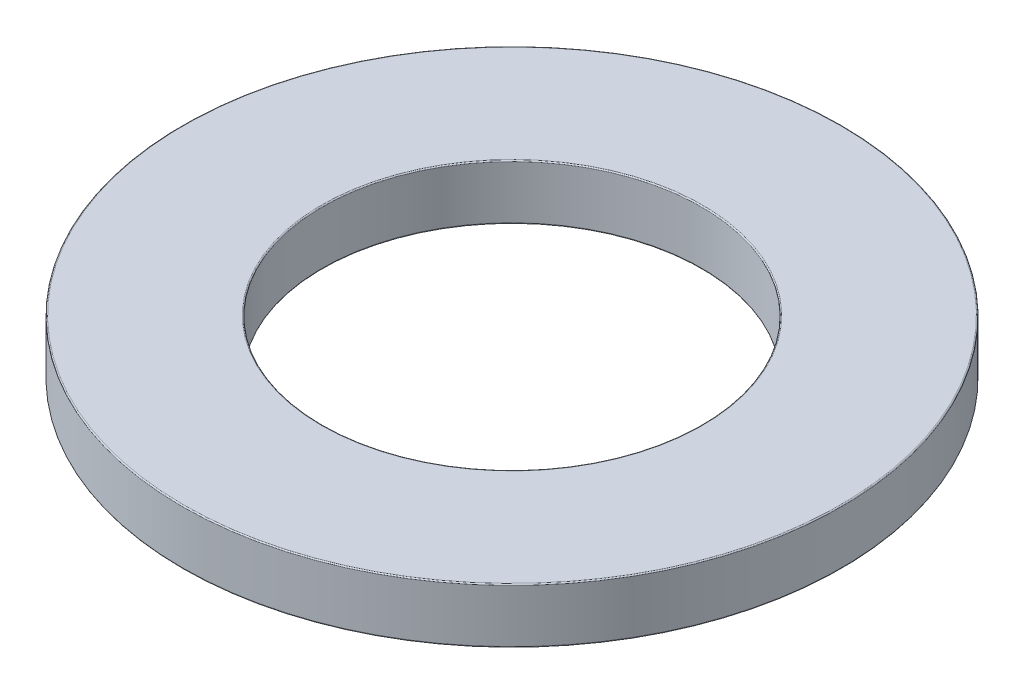
ISO-10303-21;
HEADER;
FILE_DESCRIPTION(('STEP AP214'),'2;1');
FILE_NAME('part.step','',(''),(''),'','','');
FILE_SCHEMA(('AUTOMOTIVE_DESIGN { 1 0 10303 214 1 1 1 1 }'));
ENDSEC;
DATA;
#1=APPLICATION_CONTEXT('core data for automotive mechanical design processes');
#2=APPLICATION_PROTOCOL_DEFINITION('international standard','automotive_design',2000,#1);
#3=PRODUCT_CONTEXT('',#1,'mechanical');
#4=PRODUCT('Part','Part','',(#3));
#5=PRODUCT_RELATED_PRODUCT_CATEGORY('part','',(#4));
#6=PRODUCT_DEFINITION_FORMATION('','',#4);
#7=PRODUCT_DEFINITION_CONTEXT('part definition',#1,'design');
#8=PRODUCT_DEFINITION('design','',#6,#7);
#9=PRODUCT_DEFINITION_SHAPE('','',#8);
#10=(LENGTH_UNIT() NAMED_UNIT(*) SI_UNIT(.MILLI.,.METRE.));
#11=(NAMED_UNIT(*) PLANE_ANGLE_UNIT() SI_UNIT($,.RADIAN.));
#12=(NAMED_UNIT(*) SI_UNIT($,.STERADIAN.) SOLID_ANGLE_UNIT());
#13=UNCERTAINTY_MEASURE_WITH_UNIT(LENGTH_MEASURE(1.E-05),#10,'distance_accuracy_value','');
#14=(GEOMETRIC_REPRESENTATION_CONTEXT(3) GLOBAL_UNCERTAINTY_ASSIGNED_CONTEXT((#13)) GLOBAL_UNIT_ASSIGNED_CONTEXT((#10,
#11,#12)) REPRESENTATION_CONTEXT('',''));
#15=CARTESIAN_POINT('',(0.,0.,0.));
#16=DIRECTION('',(0.,0.,1.));
#17=DIRECTION('',(1.,0.,0.));
#18=AXIS2_PLACEMENT_3D('',#15,#16,#17);
#19=CARTESIAN_POINT('',(0.,0.38735,0.));
#20=DIRECTION('',(0.,1.,0.));
#21=DIRECTION('',(0.,0.,1.));
#22=AXIS2_PLACEMENT_3D('',#19,#20,#21);
#23=PLANE('',#22);
#24=CARTESIAN_POINT('',(0.,0.38735,0.));
#25=DIRECTION('',(0.,1.,0.));
#26=DIRECTION('',(0.,0.,1.));
#27=AXIS2_PLACEMENT_3D('',#24,#25,#26);
#28=CIRCLE('',#27,2.682875);
#29=CARTESIAN_POINT('',(0.,0.38735,2.682875));
#30=VERTEX_POINT('',#29);
#31=EDGE_CURVE('E46',#30,#30,#28,.F.);
#32=ORIENTED_EDGE('',*,*,#31,.T.);
#33=EDGE_LOOP('',(#32));
#34=FACE_BOUND('',#33,.T.);
#35=CARTESIAN_POINT('',(0.,0.38735,0.));
#36=DIRECTION('',(0.,1.,0.));
#37=DIRECTION('',(0.,0.,1.));
#38=AXIS2_PLACEMENT_3D('',#35,#36,#37);
#39=CIRCLE('',#38,4.619625);
#40=CARTESIAN_POINT('',(0.,0.38735,4.619625));
#41=VERTEX_POINT('',#40);
#42=EDGE_CURVE('E50',#41,#41,#39,.T.);
#43=ORIENTED_EDGE('',*,*,#42,.T.);
#44=EDGE_LOOP('',(#43));
#45=FACE_BOUND('',#44,.T.);
#46=ADVANCED_FACE('F35',(#34,#45),#23,.T.);
#47=CARTESIAN_POINT('',(0.,-0.38735,0.));
#48=DIRECTION('',(0.,1.,0.));
#49=DIRECTION('',(0.,0.,1.));
#50=AXIS2_PLACEMENT_3D('',#47,#48,#49);
#51=PLANE('',#50);
#52=CARTESIAN_POINT('',(0.,-0.38735,0.));
#53=DIRECTION('',(0.,1.,0.));
#54=DIRECTION('',(0.,0.,1.));
#55=AXIS2_PLACEMENT_3D('',#52,#53,#54);
#56=CIRCLE('',#55,2.682875);
#57=CARTESIAN_POINT('',(0.,-0.38735,2.682875));
#58=VERTEX_POINT('',#57);
#59=EDGE_CURVE('E61',#58,#58,#56,.T.);
#60=ORIENTED_EDGE('',*,*,#59,.T.);
#61=EDGE_LOOP('',(#60));
#62=FACE_BOUND('',#61,.T.);
#63=CARTESIAN_POINT('',(0.,-0.38735,0.));
#64=DIRECTION('',(0.,1.,0.));
#65=DIRECTION('',(0.,0.,1.));
#66=AXIS2_PLACEMENT_3D('',#63,#64,#65);
#67=CIRCLE('',#66,4.619625);
#68=CARTESIAN_POINT('',(0.,-0.38735,4.619625));
#69=VERTEX_POINT('',#68);
#70=EDGE_CURVE('E64',#69,#69,#67,.F.);
#71=ORIENTED_EDGE('',*,*,#70,.T.);
#72=EDGE_LOOP('',(#71));
#73=FACE_BOUND('',#72,.T.);
#74=ADVANCED_FACE('F68',(#62,#73),#51,.F.);
#75=CARTESIAN_POINT('',(0.,0.38735,0.));
#76=DIRECTION('',(0.,-1.,0.));
#77=DIRECTION('',(0.,0.,-1.));
#78=AXIS2_PLACEMENT_3D('',#75,#76,#77);
#79=CYLINDRICAL_SURFACE('',#78,4.6355);
#80=CARTESIAN_POINT('',(0.,-0.371475,0.));
#81=DIRECTION('',(0.,1.,0.));
#82=DIRECTION('',(0.,0.,1.));
#83=AXIS2_PLACEMENT_3D('',#80,#81,#82);
#84=CIRCLE('',#83,4.6355);
#85=CARTESIAN_POINT('',(0.,-0.371475,4.6355));
#86=VERTEX_POINT('',#85);
#87=EDGE_CURVE('E10',#86,#86,#84,.T.);
#88=ORIENTED_EDGE('',*,*,#87,.T.);
#89=EDGE_LOOP('',(#88));
#90=FACE_BOUND('',#89,.T.);
#91=CARTESIAN_POINT('',(0.,0.371475,0.));
#92=DIRECTION('',(0.,1.,0.));
#93=DIRECTION('',(0.,0.,1.));
#94=AXIS2_PLACEMENT_3D('',#91,#92,#93);
#95=CIRCLE('',#94,4.6355);
#96=CARTESIAN_POINT('',(0.,0.371475,4.6355));
#97=VERTEX_POINT('',#96);
#98=EDGE_CURVE('E42',#97,#97,#95,.F.);
#99=ORIENTED_EDGE('',*,*,#98,.T.);
#100=EDGE_LOOP('',(#99));
#101=FACE_BOUND('',#100,.T.);
#102=ADVANCED_FACE('F88',(#90,#101),#79,.T.);
#103=CARTESIAN_POINT('',(0.,0.38735,0.));
#104=DIRECTION('',(0.,-1.,0.));
#105=DIRECTION('',(0.,0.,-1.));
#106=AXIS2_PLACEMENT_3D('',#103,#104,#105);
#107=CYLINDRICAL_SURFACE('',#106,2.667);
#108=CARTESIAN_POINT('',(0.,-0.371475,0.));
#109=DIRECTION('',(0.,1.,0.));
#110=DIRECTION('',(0.,0.,1.));
#111=AXIS2_PLACEMENT_3D('',#108,#109,#110);
#112=CIRCLE('',#111,2.667);
#113=CARTESIAN_POINT('',(0.,-0.371475,2.667));
#114=VERTEX_POINT('',#113);
#115=EDGE_CURVE('E55',#114,#114,#112,.F.);
#116=ORIENTED_EDGE('',*,*,#115,.T.);
#117=EDGE_LOOP('',(#116));
#118=FACE_BOUND('',#117,.T.);
#119=CARTESIAN_POINT('',(0.,0.371475,0.));
#120=DIRECTION('',(0.,1.,0.));
#121=DIRECTION('',(0.,0.,1.));
#122=AXIS2_PLACEMENT_3D('',#119,#120,#121);
#123=CIRCLE('',#122,2.667);
#124=CARTESIAN_POINT('',(0.,0.371475,2.667));
#125=VERTEX_POINT('',#124);
#126=EDGE_CURVE('E58',#125,#125,#123,.T.);
#127=ORIENTED_EDGE('',*,*,#126,.T.);
#128=EDGE_LOOP('',(#127));
#129=FACE_BOUND('',#128,.T.);
#130=ADVANCED_FACE('F93',(#118,#129),#107,.F.);
#131=CARTESIAN_POINT('',(0.,-0.371475,0.));
#132=DIRECTION('',(0.,1.,0.));
#133=DIRECTION('',(0.,0.,1.));
#134=AXIS2_PLACEMENT_3D('',#131,#132,#133);
#135=TOROIDAL_SURFACE('',#134,2.682875,0.015875);
#136=ORIENTED_EDGE('',*,*,#115,.F.);
#137=EDGE_LOOP('',(#136));
#138=FACE_BOUND('',#137,.T.);
#139=ORIENTED_EDGE('',*,*,#59,.F.);
#140=EDGE_LOOP('',(#139));
#141=FACE_BOUND('',#140,.T.);
#142=ADVANCED_FACE('F79',(#138,#141),#135,.T.);
#143=CARTESIAN_POINT('',(0.,0.371475,0.));
#144=DIRECTION('',(0.,1.,0.));
#145=DIRECTION('',(0.,0.,1.));
#146=AXIS2_PLACEMENT_3D('',#143,#144,#145);
#147=TOROIDAL_SURFACE('',#146,2.682875,0.015875);
#148=ORIENTED_EDGE('',*,*,#31,.F.);
#149=EDGE_LOOP('',(#148));
#150=FACE_BOUND('',#149,.T.);
#151=ORIENTED_EDGE('',*,*,#126,.F.);
#152=EDGE_LOOP('',(#151));
#153=FACE_BOUND('',#152,.T.);
#154=ADVANCED_FACE('F73',(#150,#153),#147,.T.);
#155=CARTESIAN_POINT('',(0.,-0.371475,0.));
#156=DIRECTION('',(0.,1.,0.));
#157=DIRECTION('',(0.,0.,1.));
#158=AXIS2_PLACEMENT_3D('',#155,#156,#157);
#159=TOROIDAL_SURFACE('',#158,4.619625,0.015875);
#160=ORIENTED_EDGE('',*,*,#70,.F.);
#161=EDGE_LOOP('',(#160));
#162=FACE_BOUND('',#161,.T.);
#163=ORIENTED_EDGE('',*,*,#87,.F.);
#164=EDGE_LOOP('',(#163));
#165=FACE_BOUND('',#164,.T.);
#166=ADVANCED_FACE('F70',(#162,#165),#159,.T.);
#167=CARTESIAN_POINT('',(0.,0.371475,0.));
#168=DIRECTION('',(0.,1.,0.));
#169=DIRECTION('',(0.,0.,1.));
#170=AXIS2_PLACEMENT_3D('',#167,#168,#169);
#171=TOROIDAL_SURFACE('',#170,4.619625,0.015875);
#172=ORIENTED_EDGE('',*,*,#98,.F.);
#173=EDGE_LOOP('',(#172));
#174=FACE_BOUND('',#173,.T.);
#175=ORIENTED_EDGE('',*,*,#42,.F.);
#176=EDGE_LOOP('',(#175));
#177=FACE_BOUND('',#176,.T.);
#178=ADVANCED_FACE('F37',(#174,#177),#171,.T.);
#179=CLOSED_SHELL('',(#46,#74,#102,#130,#142,#154,#166,#178));
#180=MANIFOLD_SOLID_BREP('B2',#179);
#181=ADVANCED_BREP_SHAPE_REPRESENTATION('',(#18,#180),#14);
#182=SHAPE_DEFINITION_REPRESENTATION(#9,#181);
ENDSEC;
END-ISO-10303-21;
